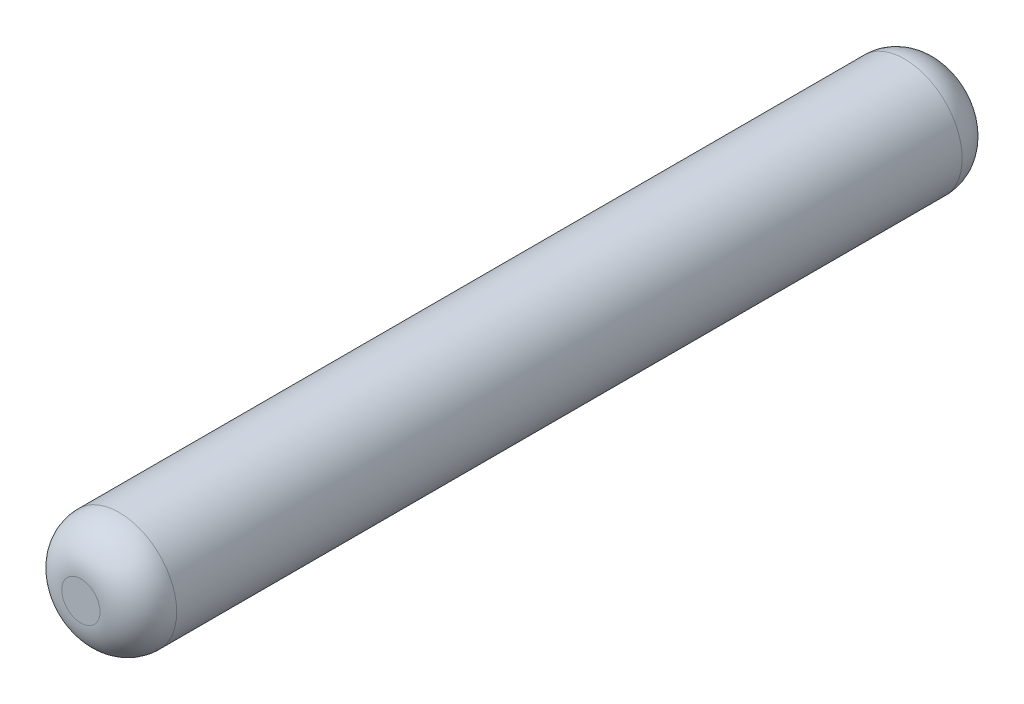
ISO-10303-21;
HEADER;
FILE_DESCRIPTION(('STEP AP214'),'2;1');
FILE_NAME('part.step','',(''),(''),'','','');
FILE_SCHEMA(('AUTOMOTIVE_DESIGN { 1 0 10303 214 1 1 1 1 }'));
ENDSEC;
DATA;
#1=APPLICATION_CONTEXT('core data for automotive mechanical design processes');
#2=APPLICATION_PROTOCOL_DEFINITION('international standard','automotive_design',2000,#1);
#3=PRODUCT_CONTEXT('',#1,'mechanical');
#4=PRODUCT('Part','Part','',(#3));
#5=PRODUCT_RELATED_PRODUCT_CATEGORY('part','',(#4));
#6=PRODUCT_DEFINITION_FORMATION('','',#4);
#7=PRODUCT_DEFINITION_CONTEXT('part definition',#1,'design');
#8=PRODUCT_DEFINITION('design','',#6,#7);
#9=PRODUCT_DEFINITION_SHAPE('','',#8);
#10=(LENGTH_UNIT() NAMED_UNIT(*) SI_UNIT(.MILLI.,.METRE.));
#11=(NAMED_UNIT(*) PLANE_ANGLE_UNIT() SI_UNIT($,.RADIAN.));
#12=(NAMED_UNIT(*) SI_UNIT($,.STERADIAN.) SOLID_ANGLE_UNIT());
#13=UNCERTAINTY_MEASURE_WITH_UNIT(LENGTH_MEASURE(1.E-05),#10,'distance_accuracy_value','');
#14=(GEOMETRIC_REPRESENTATION_CONTEXT(3) GLOBAL_UNCERTAINTY_ASSIGNED_CONTEXT((#13)) GLOBAL_UNIT_ASSIGNED_CONTEXT((#10,
#11,#12)) REPRESENTATION_CONTEXT('',''));
#15=CARTESIAN_POINT('',(0.,0.,0.));
#16=DIRECTION('',(0.,0.,1.));
#17=DIRECTION('',(1.,0.,0.));
#18=AXIS2_PLACEMENT_3D('',#15,#16,#17);
#19=CARTESIAN_POINT('',(0.,0.,45.));
#20=DIRECTION('',(0.,0.,-1.));
#21=DIRECTION('',(-1.,0.,0.));
#22=AXIS2_PLACEMENT_3D('',#19,#20,#21);
#23=CYLINDRICAL_SURFACE('',#22,3.);
#24=CARTESIAN_POINT('',(0.,0.,1.99999999999997));
#25=DIRECTION('',(0.,0.,1.));
#26=DIRECTION('',(1.,0.,0.));
#27=AXIS2_PLACEMENT_3D('',#24,#25,#26);
#28=CIRCLE('',#27,3.);
#29=CARTESIAN_POINT('',(-3.,0.,1.99999999999997));
#30=VERTEX_POINT('',#29);
#31=EDGE_CURVE('E53',#30,#30,#28,.T.);
#32=CARTESIAN_POINT('',(0.,0.,43.));
#33=DIRECTION('',(0.,0.,1.));
#34=DIRECTION('',(1.,0.,0.));
#35=AXIS2_PLACEMENT_3D('',#32,#33,#34);
#36=CIRCLE('',#35,3.);
#37=CARTESIAN_POINT('',(-3.,0.,43.));
#38=VERTEX_POINT('',#37);
#39=EDGE_CURVE('E57',#38,#38,#36,.F.);
#40=CARTESIAN_POINT('',(-3.,0.,1.99999999999997));
#41=CARTESIAN_POINT('',(-3.,0.,2.4270833333333));
#42=CARTESIAN_POINT('',(-3.,0.,2.85416666666663));
#43=CARTESIAN_POINT('',(-3.,0.,3.7083333333333));
#44=CARTESIAN_POINT('',(-3.,0.,4.13541666666663));
#45=CARTESIAN_POINT('',(-3.,0.,4.9895833333333));
#46=CARTESIAN_POINT('',(-3.,0.,5.41666666666663));
#47=CARTESIAN_POINT('',(-3.,0.,6.2708333333333));
#48=CARTESIAN_POINT('',(-3.,0.,6.69791666666664));
#49=CARTESIAN_POINT('',(-3.,0.,7.5520833333333));
#50=CARTESIAN_POINT('',(-3.,0.,7.97916666666664));
#51=CARTESIAN_POINT('',(-3.,0.,8.8333333333333));
#52=CARTESIAN_POINT('',(-3.,0.,9.26041666666664));
#53=CARTESIAN_POINT('',(-3.,0.,10.1145833333333));
#54=CARTESIAN_POINT('',(-3.,0.,10.5416666666666));
#55=CARTESIAN_POINT('',(-3.,0.,11.3958333333333));
#56=CARTESIAN_POINT('',(-3.,0.,11.8229166666666));
#57=CARTESIAN_POINT('',(-3.,0.,12.6770833333333));
#58=CARTESIAN_POINT('',(-3.,0.,13.1041666666666));
#59=CARTESIAN_POINT('',(-3.,0.,13.9583333333333));
#60=CARTESIAN_POINT('',(-3.,0.,14.3854166666666));
#61=CARTESIAN_POINT('',(-3.,0.,15.2395833333333));
#62=CARTESIAN_POINT('',(-3.,0.,15.6666666666666));
#63=CARTESIAN_POINT('',(-3.,0.,16.5208333333333));
#64=CARTESIAN_POINT('',(-3.,0.,16.9479166666666));
#65=CARTESIAN_POINT('',(-3.,0.,17.8020833333333));
#66=CARTESIAN_POINT('',(-3.,0.,18.2291666666666));
#67=CARTESIAN_POINT('',(-3.,0.,19.0833333333333));
#68=CARTESIAN_POINT('',(-3.,0.,19.5104166666666));
#69=CARTESIAN_POINT('',(-3.,0.,20.3645833333333));
#70=CARTESIAN_POINT('',(-3.,0.,20.7916666666666));
#71=CARTESIAN_POINT('',(-3.,0.,21.6458333333333));
#72=CARTESIAN_POINT('',(-3.,0.,22.0729166666666));
#73=CARTESIAN_POINT('',(-3.,0.,22.9270833333333));
#74=CARTESIAN_POINT('',(-3.,0.,23.3541666666666));
#75=CARTESIAN_POINT('',(-3.,0.,24.2083333333333));
#76=CARTESIAN_POINT('',(-3.,0.,24.6354166666666));
#77=CARTESIAN_POINT('',(-3.,0.,25.4895833333333));
#78=CARTESIAN_POINT('',(-3.,0.,25.9166666666666));
#79=CARTESIAN_POINT('',(-3.,0.,26.7708333333333));
#80=CARTESIAN_POINT('',(-3.,0.,27.1979166666666));
#81=CARTESIAN_POINT('',(-3.,0.,28.0520833333333));
#82=CARTESIAN_POINT('',(-3.,0.,28.4791666666667));
#83=CARTESIAN_POINT('',(-3.,0.,29.3333333333333));
#84=CARTESIAN_POINT('',(-3.,0.,29.7604166666667));
#85=CARTESIAN_POINT('',(-3.,0.,30.6145833333333));
#86=CARTESIAN_POINT('',(-3.,0.,31.0416666666667));
#87=CARTESIAN_POINT('',(-3.,0.,31.8958333333333));
#88=CARTESIAN_POINT('',(-3.,0.,32.3229166666666));
#89=CARTESIAN_POINT('',(-3.,0.,33.1770833333333));
#90=CARTESIAN_POINT('',(-3.,0.,33.6041666666667));
#91=CARTESIAN_POINT('',(-3.,0.,34.4583333333333));
#92=CARTESIAN_POINT('',(-3.,0.,34.8854166666667));
#93=CARTESIAN_POINT('',(-3.,0.,35.7395833333333));
#94=CARTESIAN_POINT('',(-3.,0.,36.1666666666667));
#95=CARTESIAN_POINT('',(-3.,0.,37.0208333333333));
#96=CARTESIAN_POINT('',(-3.,0.,37.4479166666667));
#97=CARTESIAN_POINT('',(-3.,0.,38.3020833333333));
#98=CARTESIAN_POINT('',(-3.,0.,38.7291666666667));
#99=CARTESIAN_POINT('',(-3.,0.,39.5833333333333));
#100=CARTESIAN_POINT('',(-3.,0.,40.0104166666667));
#101=CARTESIAN_POINT('',(-3.,0.,40.8645833333333));
#102=CARTESIAN_POINT('',(-3.,0.,41.2916666666667));
#103=CARTESIAN_POINT('',(-3.,0.,42.1458333333333));
#104=CARTESIAN_POINT('',(-3.,0.,42.5729166666667));
#105=CARTESIAN_POINT('',(-3.,0.,43.));
#106=B_SPLINE_CURVE_WITH_KNOTS('',3,(#40,#41,#42,#43,#44,#45,#46,#47,#48,#49,#50,#51,#52,#53,
#54,#55,#56,#57,#58,#59,#60,#61,#62,#63,#64,#65,#66,#67,#68,#69,#70,#71,#72,#73,#74,#75,#76,#77,
#78,#79,#80,#81,#82,#83,#84,#85,#86,#87,#88,#89,#90,#91,#92,#93,#94,#95,#96,#97,#98,#99,#100,
#101,#102,#103,#104,#105),.UNSPECIFIED.,.F.,.F.,(4,2,2,2,2,2,2,2,2,2,2,2,2,2,2,2,2,2,2,2,2,2,2,
2,2,2,2,2,2,2,2,2,4),(0.,1.28125,2.5625,3.84375,5.125,6.40625,7.68750000000001,8.96875000000001,
10.25,11.53125,12.8125,14.09375,15.375,16.65625,17.9375,19.21875,20.5,21.78125,23.0625,24.34375,
25.625,26.90625,28.1875,29.46875,30.75,32.03125,33.3125,34.59375,35.875,37.15625,38.4375,
39.71875,41.),.UNSPECIFIED.);
#107=EDGE_CURVE('BSEAM42',#30,#38,#106,.T.);
#108=ORIENTED_EDGE('',*,*,#31,.T.);
#109=ORIENTED_EDGE('',*,*,#39,.T.);
#110=ORIENTED_EDGE('',*,*,#107,.T.);
#111=ORIENTED_EDGE('',*,*,#107,.F.);
#112=EDGE_LOOP('',(#108,#110,#109,#111));
#113=FACE_BOUND('',#112,.T.);
#114=ADVANCED_FACE('F42',(#113),#23,.T.);
#115=CARTESIAN_POINT('',(0.,0.,45.));
#116=DIRECTION('',(0.,0.,1.));
#117=DIRECTION('',(1.,0.,0.));
#118=AXIS2_PLACEMENT_3D('',#115,#116,#117);
#119=PLANE('',#118);
#120=CARTESIAN_POINT('',(0.,0.,45.));
#121=DIRECTION('',(0.,0.,1.));
#122=DIRECTION('',(1.,0.,0.));
#123=AXIS2_PLACEMENT_3D('',#120,#121,#122);
#124=CIRCLE('',#123,1.);
#125=CARTESIAN_POINT('',(1.,0.,45.));
#126=VERTEX_POINT('',#125);
#127=EDGE_CURVE('E12',#126,#126,#124,.T.);
#128=ORIENTED_EDGE('',*,*,#127,.T.);
#129=EDGE_LOOP('',(#128));
#130=FACE_BOUND('',#129,.T.);
#131=ADVANCED_FACE('F73',(#130),#119,.T.);
#132=CARTESIAN_POINT('',(0.,0.,0.));
#133=DIRECTION('',(0.,0.,1.));
#134=DIRECTION('',(1.,0.,0.));
#135=AXIS2_PLACEMENT_3D('',#132,#133,#134);
#136=PLANE('',#135);
#137=CARTESIAN_POINT('',(0.,0.,0.));
#138=DIRECTION('',(0.,0.,1.));
#139=DIRECTION('',(1.,0.,0.));
#140=AXIS2_PLACEMENT_3D('',#137,#138,#139);
#141=CIRCLE('',#140,1.);
#142=CARTESIAN_POINT('',(1.,0.,0.));
#143=VERTEX_POINT('',#142);
#144=EDGE_CURVE('E49',#143,#143,#141,.F.);
#145=ORIENTED_EDGE('',*,*,#144,.T.);
#146=EDGE_LOOP('',(#145));
#147=FACE_BOUND('',#146,.T.);
#148=ADVANCED_FACE('F70',(#147),#136,.F.);
#149=CARTESIAN_POINT('',(0.,0.,2.));
#150=DIRECTION('',(0.,0.,1.));
#151=DIRECTION('',(1.,0.,0.));
#152=AXIS2_PLACEMENT_3D('',#149,#150,#151);
#153=DEGENERATE_TOROIDAL_SURFACE('',#152,1.,2.,.T.);
#154=ORIENTED_EDGE('',*,*,#144,.F.);
#155=EDGE_LOOP('',(#154));
#156=FACE_BOUND('',#155,.T.);
#157=ORIENTED_EDGE('',*,*,#31,.F.);
#158=EDGE_LOOP('',(#157));
#159=FACE_BOUND('',#158,.T.);
#160=ADVANCED_FACE('F66',(#156,#159),#153,.T.);
#161=CARTESIAN_POINT('',(0.,0.,43.));
#162=DIRECTION('',(0.,0.,1.));
#163=DIRECTION('',(1.,0.,0.));
#164=AXIS2_PLACEMENT_3D('',#161,#162,#163);
#165=DEGENERATE_TOROIDAL_SURFACE('',#164,1.,2.,.T.);
#166=ORIENTED_EDGE('',*,*,#39,.F.);
#167=EDGE_LOOP('',(#166));
#168=FACE_BOUND('',#167,.T.);
#169=ORIENTED_EDGE('',*,*,#127,.F.);
#170=EDGE_LOOP('',(#169));
#171=FACE_BOUND('',#170,.T.);
#172=ADVANCED_FACE('F44',(#168,#171),#165,.T.);
#173=CLOSED_SHELL('',(#114,#131,#148,#160,#172));
#174=MANIFOLD_SOLID_BREP('B2',#173);
#175=ADVANCED_BREP_SHAPE_REPRESENTATION('',(#18,#174),#14);
#176=SHAPE_DEFINITION_REPRESENTATION(#9,#175);
ENDSEC;
END-ISO-10303-21;
